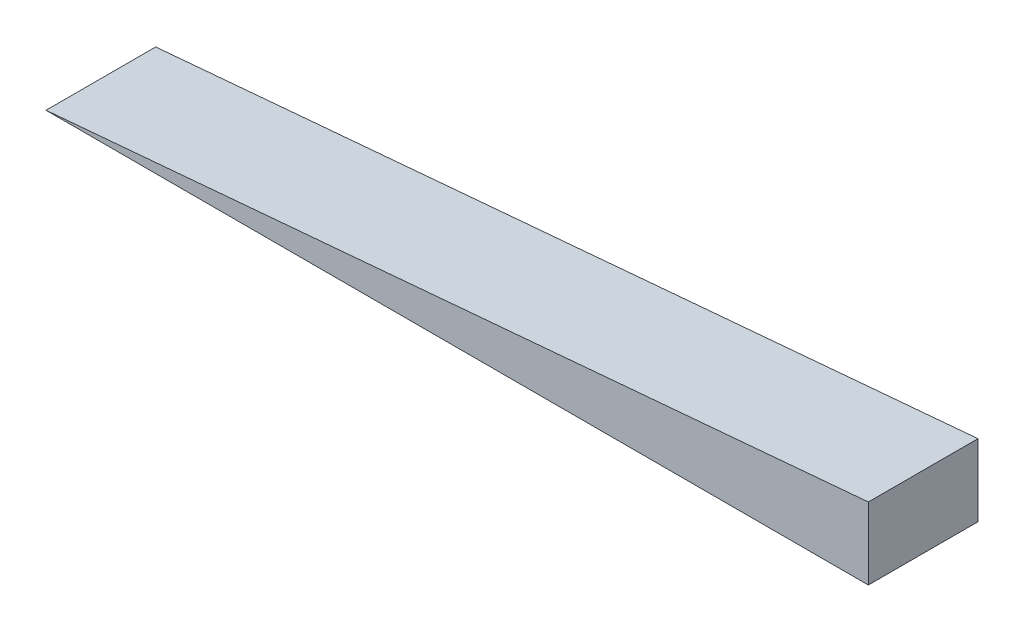
ISO-10303-21;
HEADER;
FILE_DESCRIPTION(('STEP AP214'),'2;1');
FILE_NAME('part.step','',(''),(''),'','','');
FILE_SCHEMA(('AUTOMOTIVE_DESIGN { 1 0 10303 214 1 1 1 1 }'));
ENDSEC;
DATA;
#1=APPLICATION_CONTEXT('core data for automotive mechanical design processes');
#2=APPLICATION_PROTOCOL_DEFINITION('international standard','automotive_design',2000,#1);
#3=PRODUCT_CONTEXT('',#1,'mechanical');
#4=PRODUCT('Part','Part','',(#3));
#5=PRODUCT_RELATED_PRODUCT_CATEGORY('part','',(#4));
#6=PRODUCT_DEFINITION_FORMATION('','',#4);
#7=PRODUCT_DEFINITION_CONTEXT('part definition',#1,'design');
#8=PRODUCT_DEFINITION('design','',#6,#7);
#9=PRODUCT_DEFINITION_SHAPE('','',#8);
#10=(LENGTH_UNIT() NAMED_UNIT(*) SI_UNIT(.MILLI.,.METRE.));
#11=(NAMED_UNIT(*) PLANE_ANGLE_UNIT() SI_UNIT($,.RADIAN.));
#12=(NAMED_UNIT(*) SI_UNIT($,.STERADIAN.) SOLID_ANGLE_UNIT());
#13=UNCERTAINTY_MEASURE_WITH_UNIT(LENGTH_MEASURE(1.E-05),#10,'distance_accuracy_value','');
#14=(GEOMETRIC_REPRESENTATION_CONTEXT(3) GLOBAL_UNCERTAINTY_ASSIGNED_CONTEXT((#13)) GLOBAL_UNIT_ASSIGNED_CONTEXT((#10,
#11,#12)) REPRESENTATION_CONTEXT('',''));
#15=CARTESIAN_POINT('',(0.,0.,0.));
#16=DIRECTION('',(0.,0.,1.));
#17=DIRECTION('',(1.,0.,0.));
#18=AXIS2_PLACEMENT_3D('',#15,#16,#17);
#19=CARTESIAN_POINT('',(45.5435513307819,13.1232995288876,10.));
#20=DIRECTION('',(0.0871557427476516,-0.996194698091746,0.));
#21=DIRECTION('',(0.996194698091746,0.0871557427476516,0.));
#22=AXIS2_PLACEMENT_3D('',#19,#20,#21);
#23=PLANE('',#22);
#24=DIRECTION('',(-0.996194698091746,-0.0871557427476516,0.));
#25=VECTOR('',#24,1.);
#26=CARTESIAN_POINT('',(45.5435513307819,13.1232995288876,-10.));
#27=LINE('',#26,#25);
#28=CARTESIAN_POINT('',(45.5435513307819,13.1232995288876,-10.));
#29=VERTEX_POINT('',#28);
#30=CARTESIAN_POINT('',(-104.456448669218,0.,-10.));
#31=VERTEX_POINT('',#30);
#32=EDGE_CURVE('E93',#29,#31,#27,.T.);
#33=ORIENTED_EDGE('',*,*,#32,.T.);
#34=DIRECTION('',(0.,0.,-1.));
#35=VECTOR('',#34,1.);
#36=CARTESIAN_POINT('',(-104.456448669218,0.,10.));
#37=LINE('',#36,#35);
#38=CARTESIAN_POINT('',(-104.456448669218,0.,10.));
#39=VERTEX_POINT('',#38);
#40=EDGE_CURVE('E11',#39,#31,#37,.T.);
#41=ORIENTED_EDGE('',*,*,#40,.F.);
#42=DIRECTION('',(-0.996194698091746,-0.0871557427476516,0.));
#43=VECTOR('',#42,1.);
#44=CARTESIAN_POINT('',(45.5435513307819,13.1232995288876,10.));
#45=LINE('',#44,#43);
#46=CARTESIAN_POINT('',(45.5435513307819,13.1232995288876,10.));
#47=VERTEX_POINT('',#46);
#48=EDGE_CURVE('E85',#47,#39,#45,.T.);
#49=ORIENTED_EDGE('',*,*,#48,.F.);
#50=DIRECTION('',(0.,0.,-1.));
#51=VECTOR('',#50,1.);
#52=CARTESIAN_POINT('',(45.5435513307819,13.1232995288876,10.));
#53=LINE('',#52,#51);
#54=EDGE_CURVE('E94',#47,#29,#53,.T.);
#55=ORIENTED_EDGE('',*,*,#54,.T.);
#56=EDGE_LOOP('',(#33,#41,#49,#55));
#57=FACE_BOUND('',#56,.T.);
#58=ADVANCED_FACE('F43',(#57),#23,.F.);
#59=CARTESIAN_POINT('',(-104.456448669218,0.,10.));
#60=DIRECTION('',(0.,1.,0.));
#61=DIRECTION('',(0.,0.,1.));
#62=AXIS2_PLACEMENT_3D('',#59,#60,#61);
#63=PLANE('',#62);
#64=DIRECTION('',(1.,0.,0.));
#65=VECTOR('',#64,1.);
#66=CARTESIAN_POINT('',(-104.456448669218,0.,-10.));
#67=LINE('',#66,#65);
#68=CARTESIAN_POINT('',(45.5435513307819,0.,-10.));
#69=VERTEX_POINT('',#68);
#70=EDGE_CURVE('E72',#31,#69,#67,.T.);
#71=ORIENTED_EDGE('',*,*,#70,.T.);
#72=DIRECTION('',(0.,0.,-1.));
#73=VECTOR('',#72,1.);
#74=CARTESIAN_POINT('',(45.5435513307819,0.,10.));
#75=LINE('',#74,#73);
#76=CARTESIAN_POINT('',(45.5435513307819,0.,10.));
#77=VERTEX_POINT('',#76);
#78=EDGE_CURVE('E52',#77,#69,#75,.T.);
#79=ORIENTED_EDGE('',*,*,#78,.F.);
#80=DIRECTION('',(1.,0.,0.));
#81=VECTOR('',#80,1.);
#82=CARTESIAN_POINT('',(-104.456448669218,0.,10.));
#83=LINE('',#82,#81);
#84=EDGE_CURVE('E80',#39,#77,#83,.T.);
#85=ORIENTED_EDGE('',*,*,#84,.F.);
#86=ORIENTED_EDGE('',*,*,#40,.T.);
#87=EDGE_LOOP('',(#71,#79,#85,#86));
#88=FACE_BOUND('',#87,.T.);
#89=ADVANCED_FACE('F81',(#88),#63,.F.);
#90=CARTESIAN_POINT('',(45.5435513307819,0.,10.));
#91=DIRECTION('',(-1.,0.,0.));
#92=DIRECTION('',(0.,0.,1.));
#93=AXIS2_PLACEMENT_3D('',#90,#91,#92);
#94=PLANE('',#93);
#95=DIRECTION('',(0.,1.,0.));
#96=VECTOR('',#95,1.);
#97=CARTESIAN_POINT('',(45.5435513307819,0.,-10.));
#98=LINE('',#97,#96);
#99=EDGE_CURVE('E77',#69,#29,#98,.T.);
#100=ORIENTED_EDGE('',*,*,#99,.T.);
#101=ORIENTED_EDGE('',*,*,#54,.F.);
#102=DIRECTION('',(0.,1.,0.));
#103=VECTOR('',#102,1.);
#104=CARTESIAN_POINT('',(45.5435513307819,0.,10.));
#105=LINE('',#104,#103);
#106=EDGE_CURVE('E60',#77,#47,#105,.T.);
#107=ORIENTED_EDGE('',*,*,#106,.F.);
#108=ORIENTED_EDGE('',*,*,#78,.T.);
#109=EDGE_LOOP('',(#100,#101,#107,#108));
#110=FACE_BOUND('',#109,.T.);
#111=ADVANCED_FACE('F106',(#110),#94,.F.);
#112=CARTESIAN_POINT('',(0.,0.,10.));
#113=DIRECTION('',(0.,0.,-1.));
#114=DIRECTION('',(-1.,0.,0.));
#115=AXIS2_PLACEMENT_3D('',#112,#113,#114);
#116=PLANE('',#115);
#117=ORIENTED_EDGE('',*,*,#48,.T.);
#118=ORIENTED_EDGE('',*,*,#84,.T.);
#119=ORIENTED_EDGE('',*,*,#106,.T.);
#120=EDGE_LOOP('',(#117,#118,#119));
#121=FACE_BOUND('',#120,.T.);
#122=ADVANCED_FACE('F88',(#121),#116,.F.);
#123=CARTESIAN_POINT('',(0.,0.,-10.));
#124=DIRECTION('',(0.,0.,-1.));
#125=DIRECTION('',(-1.,0.,0.));
#126=AXIS2_PLACEMENT_3D('',#123,#124,#125);
#127=PLANE('',#126);
#128=ORIENTED_EDGE('',*,*,#32,.F.);
#129=ORIENTED_EDGE('',*,*,#99,.F.);
#130=ORIENTED_EDGE('',*,*,#70,.F.);
#131=EDGE_LOOP('',(#128,#129,#130));
#132=FACE_BOUND('',#131,.T.);
#133=ADVANCED_FACE('F107',(#132),#127,.T.);
#134=CLOSED_SHELL('',(#58,#89,#111,#122,#133));
#135=MANIFOLD_SOLID_BREP('B2',#134);
#136=ADVANCED_BREP_SHAPE_REPRESENTATION('',(#18,#135),#14);
#137=SHAPE_DEFINITION_REPRESENTATION(#9,#136);
ENDSEC;
END-ISO-10303-21;
